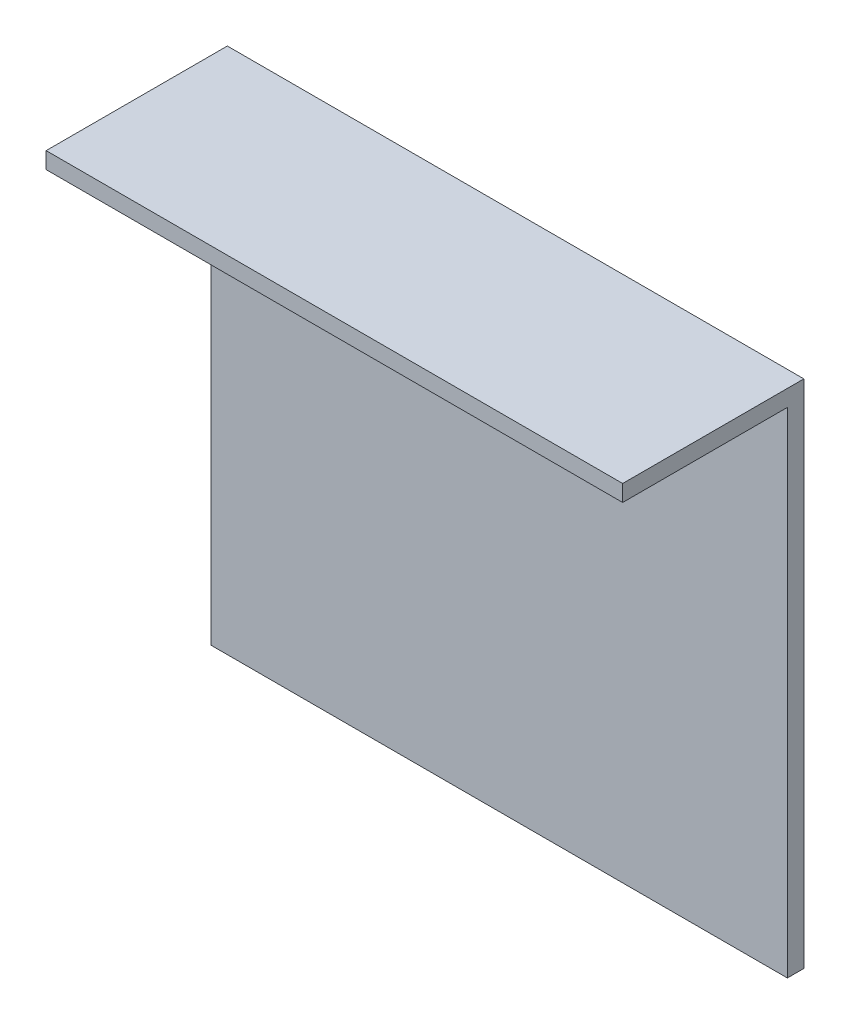
ISO-10303-21;
HEADER;
FILE_DESCRIPTION(('STEP AP214'),'2;1');
FILE_NAME('part.step','',(''),(''),'','','');
FILE_SCHEMA(('AUTOMOTIVE_DESIGN { 1 0 10303 214 1 1 1 1 }'));
ENDSEC;
DATA;
#1=APPLICATION_CONTEXT('core data for automotive mechanical design processes');
#2=APPLICATION_PROTOCOL_DEFINITION('international standard','automotive_design',2000,#1);
#3=PRODUCT_CONTEXT('',#1,'mechanical');
#4=PRODUCT('Part','Part','',(#3));
#5=PRODUCT_RELATED_PRODUCT_CATEGORY('part','',(#4));
#6=PRODUCT_DEFINITION_FORMATION('','',#4);
#7=PRODUCT_DEFINITION_CONTEXT('part definition',#1,'design');
#8=PRODUCT_DEFINITION('design','',#6,#7);
#9=PRODUCT_DEFINITION_SHAPE('','',#8);
#10=(LENGTH_UNIT() NAMED_UNIT(*) SI_UNIT(.MILLI.,.METRE.));
#11=(NAMED_UNIT(*) PLANE_ANGLE_UNIT() SI_UNIT($,.RADIAN.));
#12=(NAMED_UNIT(*) SI_UNIT($,.STERADIAN.) SOLID_ANGLE_UNIT());
#13=UNCERTAINTY_MEASURE_WITH_UNIT(LENGTH_MEASURE(1.E-05),#10,'distance_accuracy_value','');
#14=(GEOMETRIC_REPRESENTATION_CONTEXT(3) GLOBAL_UNCERTAINTY_ASSIGNED_CONTEXT((#13)) GLOBAL_UNIT_ASSIGNED_CONTEXT((#10,
#11,#12)) REPRESENTATION_CONTEXT('',''));
#15=CARTESIAN_POINT('',(0.,0.,0.));
#16=DIRECTION('',(0.,0.,1.));
#17=DIRECTION('',(1.,0.,0.));
#18=AXIS2_PLACEMENT_3D('',#15,#16,#17);
#19=CARTESIAN_POINT('',(35.,31.,2.));
#20=DIRECTION('',(-1.,0.,0.));
#21=DIRECTION('',(0.,-1.,0.));
#22=AXIS2_PLACEMENT_3D('',#19,#20,#21);
#23=PLANE('',#22);
#24=DIRECTION('',(0.,1.,0.));
#25=VECTOR('',#24,1.);
#26=CARTESIAN_POINT('',(35.,31.,0.));
#27=LINE('',#26,#25);
#28=CARTESIAN_POINT('',(35.,-31.,0.));
#29=VERTEX_POINT('',#28);
#30=CARTESIAN_POINT('',(35.,31.,0.));
#31=VERTEX_POINT('',#30);
#32=EDGE_CURVE('E92',#29,#31,#27,.T.);
#33=ORIENTED_EDGE('',*,*,#32,.T.);
#34=DIRECTION('',(0.,0.,-1.));
#35=VECTOR('',#34,1.);
#36=CARTESIAN_POINT('',(35.,31.,2.));
#37=LINE('',#36,#35);
#38=CARTESIAN_POINT('',(35.,31.,22.));
#39=VERTEX_POINT('',#38);
#40=EDGE_CURVE('E11',#39,#31,#37,.T.);
#41=ORIENTED_EDGE('',*,*,#40,.F.);
#42=DIRECTION('',(0.,1.,0.));
#43=VECTOR('',#42,1.);
#44=CARTESIAN_POINT('',(35.,31.,22.));
#45=LINE('',#44,#43);
#46=CARTESIAN_POINT('',(35.,29.,22.));
#47=VERTEX_POINT('',#46);
#48=EDGE_CURVE('E128',#47,#39,#45,.T.);
#49=ORIENTED_EDGE('',*,*,#48,.F.);
#50=DIRECTION('',(0.,0.,-1.));
#51=VECTOR('',#50,1.);
#52=CARTESIAN_POINT('',(35.,29.,22.));
#53=LINE('',#52,#51);
#54=CARTESIAN_POINT('',(35.,29.,2.));
#55=VERTEX_POINT('',#54);
#56=EDGE_CURVE('E101',#47,#55,#53,.T.);
#57=ORIENTED_EDGE('',*,*,#56,.T.);
#58=DIRECTION('',(0.,1.,0.));
#59=VECTOR('',#58,1.);
#60=CARTESIAN_POINT('',(35.,31.,2.));
#61=LINE('',#60,#59);
#62=CARTESIAN_POINT('',(35.,-31.,2.));
#63=VERTEX_POINT('',#62);
#64=EDGE_CURVE('E86',#63,#55,#61,.T.);
#65=ORIENTED_EDGE('',*,*,#64,.F.);
#66=DIRECTION('',(0.,0.,-1.));
#67=VECTOR('',#66,1.);
#68=CARTESIAN_POINT('',(35.,-31.,2.));
#69=LINE('',#68,#67);
#70=EDGE_CURVE('E79',#63,#29,#69,.T.);
#71=ORIENTED_EDGE('',*,*,#70,.T.);
#72=EDGE_LOOP('',(#33,#41,#49,#57,#65,#71));
#73=FACE_BOUND('',#72,.T.);
#74=ADVANCED_FACE('F35',(#73),#23,.F.);
#75=CARTESIAN_POINT('',(-35.,31.,2.));
#76=DIRECTION('',(0.,-1.,0.));
#77=DIRECTION('',(0.,0.,-1.));
#78=AXIS2_PLACEMENT_3D('',#75,#76,#77);
#79=PLANE('',#78);
#80=DIRECTION('',(-1.,0.,0.));
#81=VECTOR('',#80,1.);
#82=CARTESIAN_POINT('',(-35.,31.,0.));
#83=LINE('',#82,#81);
#84=CARTESIAN_POINT('',(-35.,31.,0.));
#85=VERTEX_POINT('',#84);
#86=EDGE_CURVE('E96',#31,#85,#83,.T.);
#87=ORIENTED_EDGE('',*,*,#86,.T.);
#88=DIRECTION('',(0.,0.,-1.));
#89=VECTOR('',#88,1.);
#90=CARTESIAN_POINT('',(-35.,31.,2.));
#91=LINE('',#90,#89);
#92=CARTESIAN_POINT('',(-35.,31.,22.));
#93=VERTEX_POINT('',#92);
#94=EDGE_CURVE('E43',#93,#85,#91,.T.);
#95=ORIENTED_EDGE('',*,*,#94,.F.);
#96=DIRECTION('',(-1.,0.,0.));
#97=VECTOR('',#96,1.);
#98=CARTESIAN_POINT('',(-35.,31.,22.));
#99=LINE('',#98,#97);
#100=EDGE_CURVE('E118',#39,#93,#99,.T.);
#101=ORIENTED_EDGE('',*,*,#100,.F.);
#102=ORIENTED_EDGE('',*,*,#40,.T.);
#103=EDGE_LOOP('',(#87,#95,#101,#102));
#104=FACE_BOUND('',#103,.T.);
#105=ADVANCED_FACE('F152',(#104),#79,.F.);
#106=CARTESIAN_POINT('',(-35.,31.,2.));
#107=DIRECTION('',(1.,0.,0.));
#108=DIRECTION('',(0.,1.,0.));
#109=AXIS2_PLACEMENT_3D('',#106,#107,#108);
#110=PLANE('',#109);
#111=DIRECTION('',(0.,-1.,0.));
#112=VECTOR('',#111,1.);
#113=CARTESIAN_POINT('',(-35.,31.,0.));
#114=LINE('',#113,#112);
#115=CARTESIAN_POINT('',(-35.,-31.,0.));
#116=VERTEX_POINT('',#115);
#117=EDGE_CURVE('E87',#85,#116,#114,.T.);
#118=ORIENTED_EDGE('',*,*,#117,.T.);
#119=DIRECTION('',(0.,0.,-1.));
#120=VECTOR('',#119,1.);
#121=CARTESIAN_POINT('',(-35.,-31.,2.));
#122=LINE('',#121,#120);
#123=CARTESIAN_POINT('',(-35.,-31.,2.));
#124=VERTEX_POINT('',#123);
#125=EDGE_CURVE('E82',#124,#116,#122,.T.);
#126=ORIENTED_EDGE('',*,*,#125,.F.);
#127=DIRECTION('',(0.,-1.,0.));
#128=VECTOR('',#127,1.);
#129=CARTESIAN_POINT('',(-35.,31.,2.));
#130=LINE('',#129,#128);
#131=CARTESIAN_POINT('',(-35.,29.,2.));
#132=VERTEX_POINT('',#131);
#133=EDGE_CURVE('E111',#132,#124,#130,.T.);
#134=ORIENTED_EDGE('',*,*,#133,.F.);
#135=DIRECTION('',(0.,0.,-1.));
#136=VECTOR('',#135,1.);
#137=CARTESIAN_POINT('',(-35.,29.,22.));
#138=LINE('',#137,#136);
#139=CARTESIAN_POINT('',(-35.,29.,22.));
#140=VERTEX_POINT('',#139);
#141=EDGE_CURVE('E97',#140,#132,#138,.T.);
#142=ORIENTED_EDGE('',*,*,#141,.F.);
#143=DIRECTION('',(0.,-1.,0.));
#144=VECTOR('',#143,1.);
#145=CARTESIAN_POINT('',(-35.,31.,22.));
#146=LINE('',#145,#144);
#147=EDGE_CURVE('E121',#93,#140,#146,.T.);
#148=ORIENTED_EDGE('',*,*,#147,.F.);
#149=ORIENTED_EDGE('',*,*,#94,.T.);
#150=EDGE_LOOP('',(#118,#126,#134,#142,#148,#149));
#151=FACE_BOUND('',#150,.T.);
#152=ADVANCED_FACE('F146',(#151),#110,.F.);
#153=CARTESIAN_POINT('',(-35.,-31.,2.));
#154=DIRECTION('',(0.,1.,0.));
#155=DIRECTION('',(0.,0.,1.));
#156=AXIS2_PLACEMENT_3D('',#153,#154,#155);
#157=PLANE('',#156);
#158=DIRECTION('',(1.,0.,0.));
#159=VECTOR('',#158,1.);
#160=CARTESIAN_POINT('',(-35.,-31.,0.));
#161=LINE('',#160,#159);
#162=EDGE_CURVE('E76',#116,#29,#161,.T.);
#163=ORIENTED_EDGE('',*,*,#162,.T.);
#164=ORIENTED_EDGE('',*,*,#70,.F.);
#165=DIRECTION('',(1.,0.,0.));
#166=VECTOR('',#165,1.);
#167=CARTESIAN_POINT('',(-35.,-31.,2.));
#168=LINE('',#167,#166);
#169=EDGE_CURVE('E57',#124,#63,#168,.T.);
#170=ORIENTED_EDGE('',*,*,#169,.F.);
#171=ORIENTED_EDGE('',*,*,#125,.T.);
#172=EDGE_LOOP('',(#163,#164,#170,#171));
#173=FACE_BOUND('',#172,.T.);
#174=ADVANCED_FACE('F78',(#173),#157,.F.);
#175=CARTESIAN_POINT('',(0.,0.,2.));
#176=DIRECTION('',(0.,0.,1.));
#177=DIRECTION('',(1.,0.,0.));
#178=AXIS2_PLACEMENT_3D('',#175,#176,#177);
#179=PLANE('',#178);
#180=DIRECTION('',(1.,0.,0.));
#181=VECTOR('',#180,1.);
#182=CARTESIAN_POINT('',(-35.,29.,2.));
#183=LINE('',#182,#181);
#184=EDGE_CURVE('E51',#132,#55,#183,.T.);
#185=ORIENTED_EDGE('',*,*,#184,.F.);
#186=ORIENTED_EDGE('',*,*,#133,.T.);
#187=ORIENTED_EDGE('',*,*,#169,.T.);
#188=ORIENTED_EDGE('',*,*,#64,.T.);
#189=EDGE_LOOP('',(#185,#186,#187,#188));
#190=FACE_BOUND('',#189,.T.);
#191=ADVANCED_FACE('F155',(#190),#179,.T.);
#192=CARTESIAN_POINT('',(0.,0.,0.));
#193=DIRECTION('',(0.,0.,1.));
#194=DIRECTION('',(1.,0.,0.));
#195=AXIS2_PLACEMENT_3D('',#192,#193,#194);
#196=PLANE('',#195);
#197=ORIENTED_EDGE('',*,*,#32,.F.);
#198=ORIENTED_EDGE('',*,*,#162,.F.);
#199=ORIENTED_EDGE('',*,*,#117,.F.);
#200=ORIENTED_EDGE('',*,*,#86,.F.);
#201=EDGE_LOOP('',(#197,#198,#199,#200));
#202=FACE_BOUND('',#201,.T.);
#203=ADVANCED_FACE('F95',(#202),#196,.F.);
#204=CARTESIAN_POINT('',(-35.,29.,22.));
#205=DIRECTION('',(0.,1.,0.));
#206=DIRECTION('',(0.,0.,1.));
#207=AXIS2_PLACEMENT_3D('',#204,#205,#206);
#208=PLANE('',#207);
#209=ORIENTED_EDGE('',*,*,#184,.T.);
#210=ORIENTED_EDGE('',*,*,#56,.F.);
#211=DIRECTION('',(1.,0.,0.));
#212=VECTOR('',#211,1.);
#213=CARTESIAN_POINT('',(-35.,29.,22.));
#214=LINE('',#213,#212);
#215=EDGE_CURVE('E134',#140,#47,#214,.T.);
#216=ORIENTED_EDGE('',*,*,#215,.F.);
#217=ORIENTED_EDGE('',*,*,#141,.T.);
#218=EDGE_LOOP('',(#209,#210,#216,#217));
#219=FACE_BOUND('',#218,.T.);
#220=ADVANCED_FACE('F148',(#219),#208,.F.);
#221=CARTESIAN_POINT('',(0.,0.,22.));
#222=DIRECTION('',(0.,0.,1.));
#223=DIRECTION('',(1.,0.,0.));
#224=AXIS2_PLACEMENT_3D('',#221,#222,#223);
#225=PLANE('',#224);
#226=ORIENTED_EDGE('',*,*,#147,.T.);
#227=ORIENTED_EDGE('',*,*,#215,.T.);
#228=ORIENTED_EDGE('',*,*,#48,.T.);
#229=ORIENTED_EDGE('',*,*,#100,.T.);
#230=EDGE_LOOP('',(#226,#227,#228,#229));
#231=FACE_BOUND('',#230,.T.);
#232=ADVANCED_FACE('F141',(#231),#225,.T.);
#233=CLOSED_SHELL('',(#74,#105,#152,#174,#191,#203,#220,#232));
#234=MANIFOLD_SOLID_BREP('B2',#233);
#235=ADVANCED_BREP_SHAPE_REPRESENTATION('',(#18,#234),#14);
#236=SHAPE_DEFINITION_REPRESENTATION(#9,#235);
ENDSEC;
END-ISO-10303-21;
